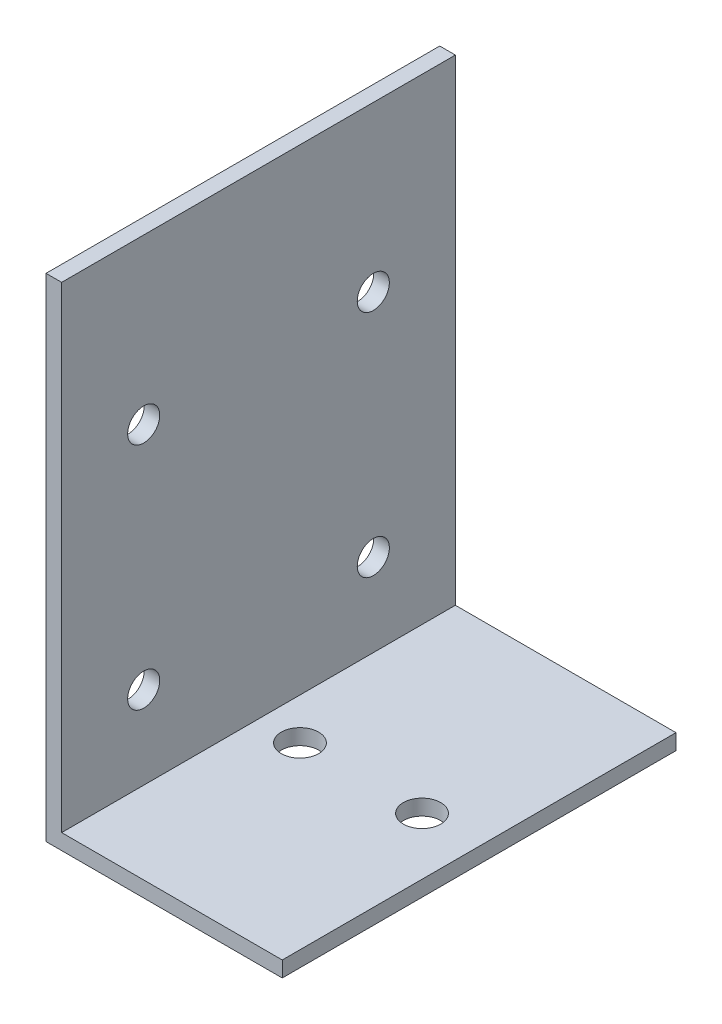
ISO-10303-21;
HEADER;
FILE_DESCRIPTION(('STEP AP214'),'2;1');
FILE_NAME('part.step','',(''),(''),'','','');
FILE_SCHEMA(('AUTOMOTIVE_DESIGN { 1 0 10303 214 1 1 1 1 }'));
ENDSEC;
DATA;
#1=APPLICATION_CONTEXT('core data for automotive mechanical design processes');
#2=APPLICATION_PROTOCOL_DEFINITION('international standard','automotive_design',2000,#1);
#3=PRODUCT_CONTEXT('',#1,'mechanical');
#4=PRODUCT('Part','Part','',(#3));
#5=PRODUCT_RELATED_PRODUCT_CATEGORY('part','',(#4));
#6=PRODUCT_DEFINITION_FORMATION('','',#4);
#7=PRODUCT_DEFINITION_CONTEXT('part definition',#1,'design');
#8=PRODUCT_DEFINITION('design','',#6,#7);
#9=PRODUCT_DEFINITION_SHAPE('','',#8);
#10=(LENGTH_UNIT() NAMED_UNIT(*) SI_UNIT(.MILLI.,.METRE.));
#11=(NAMED_UNIT(*) PLANE_ANGLE_UNIT() SI_UNIT($,.RADIAN.));
#12=(NAMED_UNIT(*) SI_UNIT($,.STERADIAN.) SOLID_ANGLE_UNIT());
#13=UNCERTAINTY_MEASURE_WITH_UNIT(LENGTH_MEASURE(1.E-05),#10,'distance_accuracy_value','');
#14=(GEOMETRIC_REPRESENTATION_CONTEXT(3) GLOBAL_UNCERTAINTY_ASSIGNED_CONTEXT((#13)) GLOBAL_UNIT_ASSIGNED_CONTEXT((#10,
#11,#12)) REPRESENTATION_CONTEXT('',''));
#15=CARTESIAN_POINT('',(0.,0.,0.));
#16=DIRECTION('',(0.,0.,1.));
#17=DIRECTION('',(1.,0.,0.));
#18=AXIS2_PLACEMENT_3D('',#15,#16,#17);
#19=CARTESIAN_POINT('',(0.,50.,20.));
#20=DIRECTION('',(0.,-1.,0.));
#21=DIRECTION('',(0.,0.,-1.));
#22=AXIS2_PLACEMENT_3D('',#19,#20,#21);
#23=PLANE('',#22);
#24=DIRECTION('',(0.,0.,-1.));
#25=VECTOR('',#24,1.);
#26=CARTESIAN_POINT('',(1.5875,50.,20.));
#27=LINE('',#26,#25);
#28=CARTESIAN_POINT('',(1.5875,50.,20.));
#29=VERTEX_POINT('',#28);
#30=CARTESIAN_POINT('',(1.5875,50.,-20.));
#31=VERTEX_POINT('',#30);
#32=EDGE_CURVE('E86',#29,#31,#27,.T.);
#33=ORIENTED_EDGE('',*,*,#32,.T.);
#34=DIRECTION('',(-1.,0.,0.));
#35=VECTOR('',#34,1.);
#36=CARTESIAN_POINT('',(0.,50.,-20.));
#37=LINE('',#36,#35);
#38=CARTESIAN_POINT('',(0.,50.,-20.));
#39=VERTEX_POINT('',#38);
#40=EDGE_CURVE('E89',#31,#39,#37,.T.);
#41=ORIENTED_EDGE('',*,*,#40,.T.);
#42=DIRECTION('',(0.,0.,-1.));
#43=VECTOR('',#42,1.);
#44=CARTESIAN_POINT('',(0.,50.,20.));
#45=LINE('',#44,#43);
#46=CARTESIAN_POINT('',(0.,50.,20.));
#47=VERTEX_POINT('',#46);
#48=EDGE_CURVE('E11',#47,#39,#45,.T.);
#49=ORIENTED_EDGE('',*,*,#48,.F.);
#50=DIRECTION('',(-1.,0.,0.));
#51=VECTOR('',#50,1.);
#52=CARTESIAN_POINT('',(0.,50.,20.));
#53=LINE('',#52,#51);
#54=EDGE_CURVE('E91',#29,#47,#53,.T.);
#55=ORIENTED_EDGE('',*,*,#54,.F.);
#56=EDGE_LOOP('',(#33,#41,#49,#55));
#57=FACE_BOUND('',#56,.T.);
#58=ADVANCED_FACE('F35',(#57),#23,.F.);
#59=CARTESIAN_POINT('',(0.,50.,20.));
#60=DIRECTION('',(1.,0.,0.));
#61=DIRECTION('',(0.,0.,-1.));
#62=AXIS2_PLACEMENT_3D('',#59,#60,#61);
#63=PLANE('',#62);
#64=CARTESIAN_POINT('',(0.,33.325,-11.6625));
#65=DIRECTION('',(-1.,0.,0.));
#66=DIRECTION('',(0.,0.,1.));
#67=AXIS2_PLACEMENT_3D('',#64,#65,#66);
#68=CIRCLE('',#67,1.63194999999999);
#69=CARTESIAN_POINT('',(0.,33.325,-10.03055));
#70=VERTEX_POINT('',#69);
#71=EDGE_CURVE('E199',#70,#70,#68,.T.);
#72=ORIENTED_EDGE('',*,*,#71,.F.);
#73=EDGE_LOOP('',(#72));
#74=FACE_BOUND('',#73,.T.);
#75=CARTESIAN_POINT('',(0.,10.,-11.6625));
#76=DIRECTION('',(-1.,0.,0.));
#77=DIRECTION('',(0.,0.,1.));
#78=AXIS2_PLACEMENT_3D('',#75,#76,#77);
#79=CIRCLE('',#78,1.63194999999999);
#80=CARTESIAN_POINT('',(0.,10.,-10.03055));
#81=VERTEX_POINT('',#80);
#82=EDGE_CURVE('E211',#81,#81,#79,.T.);
#83=ORIENTED_EDGE('',*,*,#82,.F.);
#84=EDGE_LOOP('',(#83));
#85=FACE_BOUND('',#84,.T.);
#86=CARTESIAN_POINT('',(0.,33.325,11.6625));
#87=DIRECTION('',(-1.,0.,0.));
#88=DIRECTION('',(0.,0.,1.));
#89=AXIS2_PLACEMENT_3D('',#86,#87,#88);
#90=CIRCLE('',#89,1.63194999999999);
#91=CARTESIAN_POINT('',(0.,33.325,13.29445));
#92=VERTEX_POINT('',#91);
#93=EDGE_CURVE('E120',#92,#92,#90,.T.);
#94=ORIENTED_EDGE('',*,*,#93,.F.);
#95=EDGE_LOOP('',(#94));
#96=FACE_BOUND('',#95,.T.);
#97=CARTESIAN_POINT('',(0.,10.,11.6625));
#98=DIRECTION('',(-1.,0.,0.));
#99=DIRECTION('',(0.,0.,1.));
#100=AXIS2_PLACEMENT_3D('',#97,#98,#99);
#101=CIRCLE('',#100,1.63194999999999);
#102=CARTESIAN_POINT('',(0.,10.,13.29445));
#103=VERTEX_POINT('',#102);
#104=EDGE_CURVE('E126',#103,#103,#101,.T.);
#105=ORIENTED_EDGE('',*,*,#104,.F.);
#106=EDGE_LOOP('',(#105));
#107=FACE_BOUND('',#106,.T.);
#108=ORIENTED_EDGE('',*,*,#48,.T.);
#109=DIRECTION('',(0.,-1.,0.));
#110=VECTOR('',#109,1.);
#111=CARTESIAN_POINT('',(0.,50.,-20.));
#112=LINE('',#111,#110);
#113=CARTESIAN_POINT('',(0.,0.,-20.));
#114=VERTEX_POINT('',#113);
#115=EDGE_CURVE('E104',#39,#114,#112,.T.);
#116=ORIENTED_EDGE('',*,*,#115,.T.);
#117=DIRECTION('',(0.,0.,-1.));
#118=VECTOR('',#117,1.);
#119=CARTESIAN_POINT('',(0.,0.,20.));
#120=LINE('',#119,#118);
#121=CARTESIAN_POINT('',(0.,0.,20.));
#122=VERTEX_POINT('',#121);
#123=EDGE_CURVE('E42',#122,#114,#120,.T.);
#124=ORIENTED_EDGE('',*,*,#123,.F.);
#125=DIRECTION('',(0.,-1.,0.));
#126=VECTOR('',#125,1.);
#127=CARTESIAN_POINT('',(0.,50.,20.));
#128=LINE('',#127,#126);
#129=EDGE_CURVE('E133',#47,#122,#128,.T.);
#130=ORIENTED_EDGE('',*,*,#129,.F.);
#131=EDGE_LOOP('',(#108,#116,#124,#130));
#132=FACE_BOUND('',#131,.T.);
#133=ADVANCED_FACE('F152',(#74,#85,#96,#107,#132),#63,.F.);
#134=CARTESIAN_POINT('',(0.,0.,20.));
#135=DIRECTION('',(0.,1.,0.));
#136=DIRECTION('',(0.,0.,1.));
#137=AXIS2_PLACEMENT_3D('',#134,#135,#136);
#138=PLANE('',#137);
#139=CARTESIAN_POINT('',(18.2,0.,0.));
#140=DIRECTION('',(0.,-1.,0.));
#141=DIRECTION('',(0.,0.,-1.));
#142=AXIS2_PLACEMENT_3D('',#139,#140,#141);
#143=CIRCLE('',#142,1.89864999999999);
#144=CARTESIAN_POINT('',(18.2,0.,-1.89864999999998));
#145=VERTEX_POINT('',#144);
#146=EDGE_CURVE('E305',#145,#145,#143,.T.);
#147=ORIENTED_EDGE('',*,*,#146,.F.);
#148=EDGE_LOOP('',(#147));
#149=FACE_BOUND('',#148,.T.);
#150=CARTESIAN_POINT('',(5.8,0.,0.));
#151=DIRECTION('',(0.,-1.,0.));
#152=DIRECTION('',(0.,0.,-1.));
#153=AXIS2_PLACEMENT_3D('',#150,#151,#152);
#154=CIRCLE('',#153,1.89864999999999);
#155=CARTESIAN_POINT('',(5.8,0.,-1.89864999999998));
#156=VERTEX_POINT('',#155);
#157=EDGE_CURVE('E200',#156,#156,#154,.T.);
#158=ORIENTED_EDGE('',*,*,#157,.F.);
#159=EDGE_LOOP('',(#158));
#160=FACE_BOUND('',#159,.T.);
#161=ORIENTED_EDGE('',*,*,#123,.T.);
#162=DIRECTION('',(1.,0.,0.));
#163=VECTOR('',#162,1.);
#164=CARTESIAN_POINT('',(0.,0.,-20.));
#165=LINE('',#164,#163);
#166=CARTESIAN_POINT('',(24.,0.,-20.));
#167=VERTEX_POINT('',#166);
#168=EDGE_CURVE('E116',#114,#167,#165,.T.);
#169=ORIENTED_EDGE('',*,*,#168,.T.);
#170=DIRECTION('',(0.,0.,-1.));
#171=VECTOR('',#170,1.);
#172=CARTESIAN_POINT('',(24.,0.,20.));
#173=LINE('',#172,#171);
#174=CARTESIAN_POINT('',(24.,0.,20.));
#175=VERTEX_POINT('',#174);
#176=EDGE_CURVE('E144',#175,#167,#173,.T.);
#177=ORIENTED_EDGE('',*,*,#176,.F.);
#178=DIRECTION('',(1.,0.,0.));
#179=VECTOR('',#178,1.);
#180=CARTESIAN_POINT('',(0.,0.,20.));
#181=LINE('',#180,#179);
#182=EDGE_CURVE('E135',#122,#175,#181,.T.);
#183=ORIENTED_EDGE('',*,*,#182,.F.);
#184=EDGE_LOOP('',(#161,#169,#177,#183));
#185=FACE_BOUND('',#184,.T.);
#186=ADVANCED_FACE('F148',(#149,#160,#185),#138,.F.);
#187=CARTESIAN_POINT('',(24.,1.5875,20.));
#188=DIRECTION('',(-1.,0.,0.));
#189=DIRECTION('',(0.,0.,1.));
#190=AXIS2_PLACEMENT_3D('',#187,#188,#189);
#191=PLANE('',#190);
#192=ORIENTED_EDGE('',*,*,#176,.T.);
#193=DIRECTION('',(0.,1.,0.));
#194=VECTOR('',#193,1.);
#195=CARTESIAN_POINT('',(24.,1.5875,-20.));
#196=LINE('',#195,#194);
#197=CARTESIAN_POINT('',(24.,1.5875,-20.));
#198=VERTEX_POINT('',#197);
#199=EDGE_CURVE('E110',#167,#198,#196,.T.);
#200=ORIENTED_EDGE('',*,*,#199,.T.);
#201=DIRECTION('',(0.,0.,-1.));
#202=VECTOR('',#201,1.);
#203=CARTESIAN_POINT('',(24.,1.5875,20.));
#204=LINE('',#203,#202);
#205=CARTESIAN_POINT('',(24.,1.5875,20.));
#206=VERTEX_POINT('',#205);
#207=EDGE_CURVE('E142',#206,#198,#204,.T.);
#208=ORIENTED_EDGE('',*,*,#207,.F.);
#209=DIRECTION('',(0.,1.,0.));
#210=VECTOR('',#209,1.);
#211=CARTESIAN_POINT('',(24.,1.5875,20.));
#212=LINE('',#211,#210);
#213=EDGE_CURVE('E137',#175,#206,#212,.T.);
#214=ORIENTED_EDGE('',*,*,#213,.F.);
#215=EDGE_LOOP('',(#192,#200,#208,#214));
#216=FACE_BOUND('',#215,.T.);
#217=ADVANCED_FACE('F175',(#216),#191,.F.);
#218=CARTESIAN_POINT('',(1.5875,1.5875,20.));
#219=DIRECTION('',(0.,-1.,0.));
#220=DIRECTION('',(0.,0.,-1.));
#221=AXIS2_PLACEMENT_3D('',#218,#219,#220);
#222=PLANE('',#221);
#223=CARTESIAN_POINT('',(18.2,1.5875,0.));
#224=DIRECTION('',(0.,-1.,0.));
#225=DIRECTION('',(0.,0.,-1.));
#226=AXIS2_PLACEMENT_3D('',#223,#224,#225);
#227=CIRCLE('',#226,1.89864999999999);
#228=CARTESIAN_POINT('',(18.2,1.5875,-1.89864999999999));
#229=VERTEX_POINT('',#228);
#230=EDGE_CURVE('E191',#229,#229,#227,.T.);
#231=ORIENTED_EDGE('',*,*,#230,.T.);
#232=EDGE_LOOP('',(#231));
#233=FACE_BOUND('',#232,.T.);
#234=CARTESIAN_POINT('',(5.8,1.5875,0.));
#235=DIRECTION('',(0.,-1.,0.));
#236=DIRECTION('',(0.,0.,-1.));
#237=AXIS2_PLACEMENT_3D('',#234,#235,#236);
#238=CIRCLE('',#237,1.89864999999999);
#239=CARTESIAN_POINT('',(5.8,1.5875,-1.89864999999999));
#240=VERTEX_POINT('',#239);
#241=EDGE_CURVE('E195',#240,#240,#238,.T.);
#242=ORIENTED_EDGE('',*,*,#241,.T.);
#243=EDGE_LOOP('',(#242));
#244=FACE_BOUND('',#243,.T.);
#245=ORIENTED_EDGE('',*,*,#207,.T.);
#246=DIRECTION('',(-1.,0.,0.));
#247=VECTOR('',#246,1.);
#248=CARTESIAN_POINT('',(1.5875,1.5875,-20.));
#249=LINE('',#248,#247);
#250=CARTESIAN_POINT('',(1.5875,1.5875,-20.));
#251=VERTEX_POINT('',#250);
#252=EDGE_CURVE('E108',#198,#251,#249,.T.);
#253=ORIENTED_EDGE('',*,*,#252,.T.);
#254=DIRECTION('',(0.,0.,-1.));
#255=VECTOR('',#254,1.);
#256=CARTESIAN_POINT('',(1.5875,1.5875,20.));
#257=LINE('',#256,#255);
#258=CARTESIAN_POINT('',(1.5875,1.5875,20.));
#259=VERTEX_POINT('',#258);
#260=EDGE_CURVE('E94',#259,#251,#257,.T.);
#261=ORIENTED_EDGE('',*,*,#260,.F.);
#262=DIRECTION('',(-1.,0.,0.));
#263=VECTOR('',#262,1.);
#264=CARTESIAN_POINT('',(1.5875,1.5875,20.));
#265=LINE('',#264,#263);
#266=EDGE_CURVE('E54',#206,#259,#265,.T.);
#267=ORIENTED_EDGE('',*,*,#266,.F.);
#268=EDGE_LOOP('',(#245,#253,#261,#267));
#269=FACE_BOUND('',#268,.T.);
#270=ADVANCED_FACE('F164',(#233,#244,#269),#222,.F.);
#271=CARTESIAN_POINT('',(1.5875,50.,20.));
#272=DIRECTION('',(-1.,0.,0.));
#273=DIRECTION('',(0.,0.,1.));
#274=AXIS2_PLACEMENT_3D('',#271,#272,#273);
#275=PLANE('',#274);
#276=CARTESIAN_POINT('',(1.5875,33.325,-11.6625));
#277=DIRECTION('',(-1.,0.,0.));
#278=DIRECTION('',(0.,0.,1.));
#279=AXIS2_PLACEMENT_3D('',#276,#277,#278);
#280=CIRCLE('',#279,1.63194999999999);
#281=CARTESIAN_POINT('',(1.5875,33.325,-10.03055));
#282=VERTEX_POINT('',#281);
#283=EDGE_CURVE('E203',#282,#282,#280,.T.);
#284=ORIENTED_EDGE('',*,*,#283,.T.);
#285=EDGE_LOOP('',(#284));
#286=FACE_BOUND('',#285,.T.);
#287=CARTESIAN_POINT('',(1.5875,10.,-11.6625));
#288=DIRECTION('',(-1.,0.,0.));
#289=DIRECTION('',(0.,0.,1.));
#290=AXIS2_PLACEMENT_3D('',#287,#288,#289);
#291=CIRCLE('',#290,1.63194999999999);
#292=CARTESIAN_POINT('',(1.5875,10.,-10.03055));
#293=VERTEX_POINT('',#292);
#294=EDGE_CURVE('E105',#293,#293,#291,.T.);
#295=ORIENTED_EDGE('',*,*,#294,.T.);
#296=EDGE_LOOP('',(#295));
#297=FACE_BOUND('',#296,.T.);
#298=CARTESIAN_POINT('',(1.5875,33.325,11.6625));
#299=DIRECTION('',(-1.,0.,0.));
#300=DIRECTION('',(0.,0.,1.));
#301=AXIS2_PLACEMENT_3D('',#298,#299,#300);
#302=CIRCLE('',#301,1.63194999999999);
#303=CARTESIAN_POINT('',(1.5875,33.325,13.29445));
#304=VERTEX_POINT('',#303);
#305=EDGE_CURVE('E123',#304,#304,#302,.T.);
#306=ORIENTED_EDGE('',*,*,#305,.T.);
#307=EDGE_LOOP('',(#306));
#308=FACE_BOUND('',#307,.T.);
#309=CARTESIAN_POINT('',(1.5875,10.,11.6625));
#310=DIRECTION('',(-1.,0.,0.));
#311=DIRECTION('',(0.,0.,1.));
#312=AXIS2_PLACEMENT_3D('',#309,#310,#311);
#313=CIRCLE('',#312,1.63194999999999);
#314=CARTESIAN_POINT('',(1.5875,10.,13.29445));
#315=VERTEX_POINT('',#314);
#316=EDGE_CURVE('E129',#315,#315,#313,.T.);
#317=ORIENTED_EDGE('',*,*,#316,.T.);
#318=EDGE_LOOP('',(#317));
#319=FACE_BOUND('',#318,.T.);
#320=ORIENTED_EDGE('',*,*,#260,.T.);
#321=DIRECTION('',(0.,1.,0.));
#322=VECTOR('',#321,1.);
#323=CARTESIAN_POINT('',(1.5875,50.,-20.));
#324=LINE('',#323,#322);
#325=EDGE_CURVE('E100',#251,#31,#324,.T.);
#326=ORIENTED_EDGE('',*,*,#325,.T.);
#327=ORIENTED_EDGE('',*,*,#32,.F.);
#328=DIRECTION('',(0.,1.,0.));
#329=VECTOR('',#328,1.);
#330=CARTESIAN_POINT('',(1.5875,50.,20.));
#331=LINE('',#330,#329);
#332=EDGE_CURVE('E49',#259,#29,#331,.T.);
#333=ORIENTED_EDGE('',*,*,#332,.F.);
#334=EDGE_LOOP('',(#320,#326,#327,#333));
#335=FACE_BOUND('',#334,.T.);
#336=ADVANCED_FACE('F107',(#286,#297,#308,#319,#335),#275,.F.);
#337=CARTESIAN_POINT('',(0.,0.,20.));
#338=DIRECTION('',(0.,0.,-1.));
#339=DIRECTION('',(-1.,0.,0.));
#340=AXIS2_PLACEMENT_3D('',#337,#338,#339);
#341=PLANE('',#340);
#342=ORIENTED_EDGE('',*,*,#54,.T.);
#343=ORIENTED_EDGE('',*,*,#129,.T.);
#344=ORIENTED_EDGE('',*,*,#182,.T.);
#345=ORIENTED_EDGE('',*,*,#213,.T.);
#346=ORIENTED_EDGE('',*,*,#266,.T.);
#347=ORIENTED_EDGE('',*,*,#332,.T.);
#348=EDGE_LOOP('',(#342,#343,#344,#345,#346,#347));
#349=FACE_BOUND('',#348,.T.);
#350=ADVANCED_FACE('F153',(#349),#341,.F.);
#351=CARTESIAN_POINT('',(0.,10.,11.6625));
#352=DIRECTION('',(-1.,0.,0.));
#353=DIRECTION('',(0.,0.,1.));
#354=AXIS2_PLACEMENT_3D('',#351,#352,#353);
#355=CYLINDRICAL_SURFACE('',#354,1.63194999999999);
#356=ORIENTED_EDGE('',*,*,#104,.T.);
#357=EDGE_LOOP('',(#356));
#358=FACE_BOUND('',#357,.T.);
#359=ORIENTED_EDGE('',*,*,#316,.F.);
#360=EDGE_LOOP('',(#359));
#361=FACE_BOUND('',#360,.T.);
#362=ADVANCED_FACE('F155',(#358,#361),#355,.F.);
#363=CARTESIAN_POINT('',(0.,33.325,11.6625));
#364=DIRECTION('',(-1.,0.,0.));
#365=DIRECTION('',(0.,0.,1.));
#366=AXIS2_PLACEMENT_3D('',#363,#364,#365);
#367=CYLINDRICAL_SURFACE('',#366,1.63194999999999);
#368=ORIENTED_EDGE('',*,*,#93,.T.);
#369=EDGE_LOOP('',(#368));
#370=FACE_BOUND('',#369,.T.);
#371=ORIENTED_EDGE('',*,*,#305,.F.);
#372=EDGE_LOOP('',(#371));
#373=FACE_BOUND('',#372,.T.);
#374=ADVANCED_FACE('F161',(#370,#373),#367,.F.);
#375=CARTESIAN_POINT('',(0.,0.,-20.));
#376=DIRECTION('',(0.,0.,1.));
#377=DIRECTION('',(-1.,0.,0.));
#378=AXIS2_PLACEMENT_3D('',#375,#376,#377);
#379=PLANE('',#378);
#380=ORIENTED_EDGE('',*,*,#40,.F.);
#381=ORIENTED_EDGE('',*,*,#325,.F.);
#382=ORIENTED_EDGE('',*,*,#252,.F.);
#383=ORIENTED_EDGE('',*,*,#199,.F.);
#384=ORIENTED_EDGE('',*,*,#168,.F.);
#385=ORIENTED_EDGE('',*,*,#115,.F.);
#386=EDGE_LOOP('',(#380,#381,#382,#383,#384,#385));
#387=FACE_BOUND('',#386,.T.);
#388=ADVANCED_FACE('F98',(#387),#379,.F.);
#389=CARTESIAN_POINT('',(0.,10.,-11.6625));
#390=DIRECTION('',(-1.,0.,0.));
#391=DIRECTION('',(0.,0.,1.));
#392=AXIS2_PLACEMENT_3D('',#389,#390,#391);
#393=CYLINDRICAL_SURFACE('',#392,1.63194999999999);
#394=ORIENTED_EDGE('',*,*,#82,.T.);
#395=EDGE_LOOP('',(#394));
#396=FACE_BOUND('',#395,.T.);
#397=ORIENTED_EDGE('',*,*,#294,.F.);
#398=EDGE_LOOP('',(#397));
#399=FACE_BOUND('',#398,.T.);
#400=ADVANCED_FACE('F218',(#396,#399),#393,.F.);
#401=CARTESIAN_POINT('',(0.,33.325,-11.6625));
#402=DIRECTION('',(-1.,0.,0.));
#403=DIRECTION('',(0.,0.,1.));
#404=AXIS2_PLACEMENT_3D('',#401,#402,#403);
#405=CYLINDRICAL_SURFACE('',#404,1.63194999999999);
#406=ORIENTED_EDGE('',*,*,#71,.T.);
#407=EDGE_LOOP('',(#406));
#408=FACE_BOUND('',#407,.T.);
#409=ORIENTED_EDGE('',*,*,#283,.F.);
#410=EDGE_LOOP('',(#409));
#411=FACE_BOUND('',#410,.T.);
#412=ADVANCED_FACE('F220',(#408,#411),#405,.F.);
#413=CARTESIAN_POINT('',(5.8,0.,0.));
#414=DIRECTION('',(0.,-1.,0.));
#415=DIRECTION('',(0.,0.,-1.));
#416=AXIS2_PLACEMENT_3D('',#413,#414,#415);
#417=CYLINDRICAL_SURFACE('',#416,1.89864999999999);
#418=ORIENTED_EDGE('',*,*,#157,.T.);
#419=EDGE_LOOP('',(#418));
#420=FACE_BOUND('',#419,.T.);
#421=ORIENTED_EDGE('',*,*,#241,.F.);
#422=EDGE_LOOP('',(#421));
#423=FACE_BOUND('',#422,.T.);
#424=ADVANCED_FACE('F227',(#420,#423),#417,.F.);
#425=CARTESIAN_POINT('',(18.2,0.,0.));
#426=DIRECTION('',(0.,-1.,0.));
#427=DIRECTION('',(0.,0.,-1.));
#428=AXIS2_PLACEMENT_3D('',#425,#426,#427);
#429=CYLINDRICAL_SURFACE('',#428,1.89864999999999);
#430=ORIENTED_EDGE('',*,*,#146,.T.);
#431=EDGE_LOOP('',(#430));
#432=FACE_BOUND('',#431,.T.);
#433=ORIENTED_EDGE('',*,*,#230,.F.);
#434=EDGE_LOOP('',(#433));
#435=FACE_BOUND('',#434,.T.);
#436=ADVANCED_FACE('F289',(#432,#435),#429,.F.);
#437=CLOSED_SHELL('',(#58,#133,#186,#217,#270,#336,#350,#362,#374,#388,#400,#412,#424,#436));
#438=MANIFOLD_SOLID_BREP('B2',#437);
#439=ADVANCED_BREP_SHAPE_REPRESENTATION('',(#18,#438),#14);
#440=SHAPE_DEFINITION_REPRESENTATION(#9,#439);
ENDSEC;
END-ISO-10303-21;
